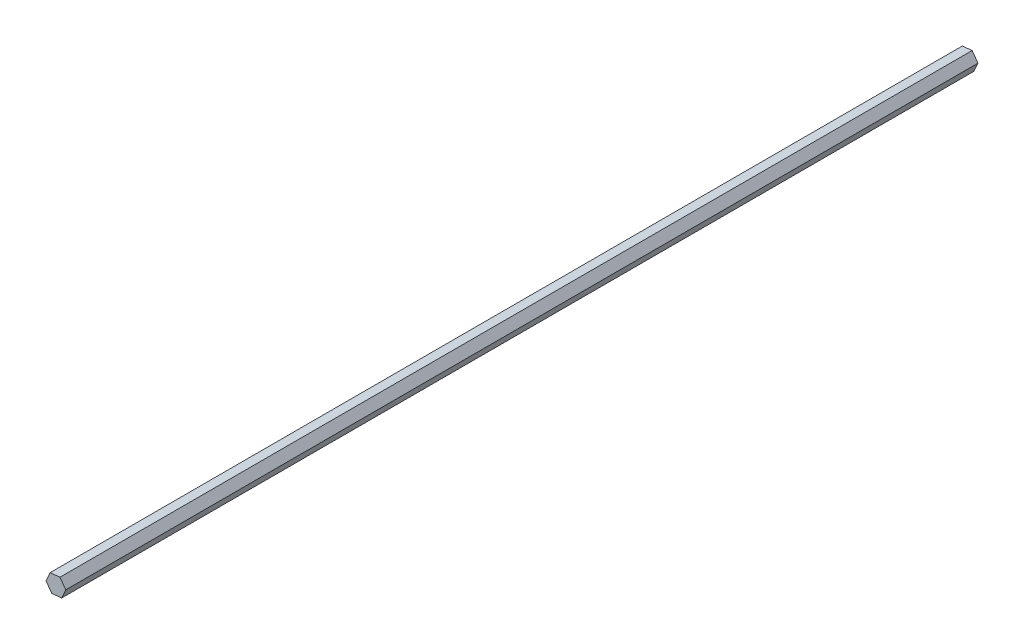
ISO-10303-21;
HEADER;
FILE_DESCRIPTION(('STEP AP214'),'2;1');
FILE_NAME('part.step','',(''),(''),'','','');
FILE_SCHEMA(('AUTOMOTIVE_DESIGN { 1 0 10303 214 1 1 1 1 }'));
ENDSEC;
DATA;
#1=APPLICATION_CONTEXT('core data for automotive mechanical design processes');
#2=APPLICATION_PROTOCOL_DEFINITION('international standard','automotive_design',2000,#1);
#3=PRODUCT_CONTEXT('',#1,'mechanical');
#4=PRODUCT('Part','Part','',(#3));
#5=PRODUCT_RELATED_PRODUCT_CATEGORY('part','',(#4));
#6=PRODUCT_DEFINITION_FORMATION('','',#4);
#7=PRODUCT_DEFINITION_CONTEXT('part definition',#1,'design');
#8=PRODUCT_DEFINITION('design','',#6,#7);
#9=PRODUCT_DEFINITION_SHAPE('','',#8);
#10=(LENGTH_UNIT() NAMED_UNIT(*) SI_UNIT(.MILLI.,.METRE.));
#11=(NAMED_UNIT(*) PLANE_ANGLE_UNIT() SI_UNIT($,.RADIAN.));
#12=(NAMED_UNIT(*) SI_UNIT($,.STERADIAN.) SOLID_ANGLE_UNIT());
#13=UNCERTAINTY_MEASURE_WITH_UNIT(LENGTH_MEASURE(1.E-05),#10,'distance_accuracy_value','');
#14=(GEOMETRIC_REPRESENTATION_CONTEXT(3) GLOBAL_UNCERTAINTY_ASSIGNED_CONTEXT((#13)) GLOBAL_UNIT_ASSIGNED_CONTEXT((#10,
#11,#12)) REPRESENTATION_CONTEXT('',''));
#15=CARTESIAN_POINT('',(0.,0.,0.));
#16=DIRECTION('',(0.,0.,1.));
#17=DIRECTION('',(1.,0.,0.));
#18=AXIS2_PLACEMENT_3D('',#15,#16,#17);
#19=CARTESIAN_POINT('',(2.98503862688406,6.6972291083211,673.1));
#20=DIRECTION('',(0.10412697657044,-0.99456401138906,0.));
#21=DIRECTION('',(0.994564011389061,0.10412697657044,0.));
#22=AXIS2_PLACEMENT_3D('',#19,#20,#21);
#23=PLANE('',#22);
#24=DIRECTION('',(-0.994564011389061,-0.10412697657044,0.));
#25=VECTOR('',#24,1.);
#26=CARTESIAN_POINT('',(2.98503862688406,6.6972291083211,0.));
#27=LINE('',#26,#25);
#28=CARTESIAN_POINT('',(2.98503862688406,6.6972291083211,0.));
#29=VERTEX_POINT('',#28);
#30=CARTESIAN_POINT('',(-4.30745122932864,5.93373383631997,0.));
#31=VERTEX_POINT('',#30);
#32=EDGE_CURVE('E117',#29,#31,#27,.T.);
#33=ORIENTED_EDGE('',*,*,#32,.T.);
#34=DIRECTION('',(0.,0.,-1.));
#35=VECTOR('',#34,1.);
#36=CARTESIAN_POINT('',(-4.30745122932864,5.93373383631997,673.1));
#37=LINE('',#36,#35);
#38=CARTESIAN_POINT('',(-4.30745122932864,5.93373383631997,673.1));
#39=VERTEX_POINT('',#38);
#40=EDGE_CURVE('E11',#39,#31,#37,.T.);
#41=ORIENTED_EDGE('',*,*,#40,.F.);
#42=DIRECTION('',(-0.994564011389061,-0.10412697657044,0.));
#43=VECTOR('',#42,1.);
#44=CARTESIAN_POINT('',(2.98503862688406,6.6972291083211,673.1));
#45=LINE('',#44,#43);
#46=CARTESIAN_POINT('',(2.98503862688406,6.6972291083211,673.1));
#47=VERTEX_POINT('',#46);
#48=EDGE_CURVE('E127',#47,#39,#45,.T.);
#49=ORIENTED_EDGE('',*,*,#48,.F.);
#50=DIRECTION('',(0.,0.,-1.));
#51=VECTOR('',#50,1.);
#52=CARTESIAN_POINT('',(2.98503862688406,6.6972291083211,673.1));
#53=LINE('',#52,#51);
#54=EDGE_CURVE('E113',#47,#29,#53,.T.);
#55=ORIENTED_EDGE('',*,*,#54,.T.);
#56=EDGE_LOOP('',(#33,#41,#49,#55));
#57=FACE_BOUND('',#56,.T.);
#58=ADVANCED_FACE('F33',(#57),#23,.F.);
#59=CARTESIAN_POINT('',(-4.30745122932864,5.93373383631997,673.1));
#60=DIRECTION('',(0.913381187837902,-0.407105398765262,0.));
#61=DIRECTION('',(0.407105398765262,0.913381187837902,0.));
#62=AXIS2_PLACEMENT_3D('',#59,#60,#61);
#63=PLANE('',#62);
#64=DIRECTION('',(-0.407105398765262,-0.913381187837902,0.));
#65=VECTOR('',#64,1.);
#66=CARTESIAN_POINT('',(-4.30745122932864,5.93373383631997,0.));
#67=LINE('',#66,#65);
#68=CARTESIAN_POINT('',(-7.2924898562127,-0.763495272001135,0.));
#69=VERTEX_POINT('',#68);
#70=EDGE_CURVE('E120',#31,#69,#67,.T.);
#71=ORIENTED_EDGE('',*,*,#70,.T.);
#72=DIRECTION('',(0.,0.,-1.));
#73=VECTOR('',#72,1.);
#74=CARTESIAN_POINT('',(-7.2924898562127,-0.763495272001135,673.1));
#75=LINE('',#74,#73);
#76=CARTESIAN_POINT('',(-7.2924898562127,-0.763495272001135,673.1));
#77=VERTEX_POINT('',#76);
#78=EDGE_CURVE('E41',#77,#69,#75,.T.);
#79=ORIENTED_EDGE('',*,*,#78,.F.);
#80=DIRECTION('',(-0.407105398765262,-0.913381187837902,0.));
#81=VECTOR('',#80,1.);
#82=CARTESIAN_POINT('',(-4.30745122932864,5.93373383631997,673.1));
#83=LINE('',#82,#81);
#84=EDGE_CURVE('E86',#39,#77,#83,.T.);
#85=ORIENTED_EDGE('',*,*,#84,.F.);
#86=ORIENTED_EDGE('',*,*,#40,.T.);
#87=EDGE_LOOP('',(#71,#79,#85,#86));
#88=FACE_BOUND('',#87,.T.);
#89=ADVANCED_FACE('F151',(#88),#63,.F.);
#90=CARTESIAN_POINT('',(-7.2924898562127,-0.763495272001135,673.1));
#91=DIRECTION('',(0.809254211267462,0.587458612623798,0.));
#92=DIRECTION('',(-0.587458612623798,0.809254211267462,0.));
#93=AXIS2_PLACEMENT_3D('',#90,#91,#92);
#94=PLANE('',#93);
#95=DIRECTION('',(0.587458612623798,-0.809254211267462,0.));
#96=VECTOR('',#95,1.);
#97=CARTESIAN_POINT('',(-7.2924898562127,-0.763495272001135,0.));
#98=LINE('',#97,#96);
#99=CARTESIAN_POINT('',(-2.98503862688406,-6.6972291083211,0.));
#100=VERTEX_POINT('',#99);
#101=EDGE_CURVE('E122',#69,#100,#98,.T.);
#102=ORIENTED_EDGE('',*,*,#101,.T.);
#103=DIRECTION('',(0.,0.,-1.));
#104=VECTOR('',#103,1.);
#105=CARTESIAN_POINT('',(-2.98503862688406,-6.6972291083211,673.1));
#106=LINE('',#105,#104);
#107=CARTESIAN_POINT('',(-2.98503862688406,-6.6972291083211,673.1));
#108=VERTEX_POINT('',#107);
#109=EDGE_CURVE('E108',#108,#100,#106,.T.);
#110=ORIENTED_EDGE('',*,*,#109,.F.);
#111=DIRECTION('',(0.587458612623798,-0.809254211267462,0.));
#112=VECTOR('',#111,1.);
#113=CARTESIAN_POINT('',(-7.2924898562127,-0.763495272001135,673.1));
#114=LINE('',#113,#112);
#115=EDGE_CURVE('E99',#77,#108,#114,.T.);
#116=ORIENTED_EDGE('',*,*,#115,.F.);
#117=ORIENTED_EDGE('',*,*,#78,.T.);
#118=EDGE_LOOP('',(#102,#110,#116,#117));
#119=FACE_BOUND('',#118,.T.);
#120=ADVANCED_FACE('F133',(#119),#94,.F.);
#121=CARTESIAN_POINT('',(-2.98503862688406,-6.6972291083211,673.1));
#122=DIRECTION('',(-0.10412697657044,0.99456401138906,0.));
#123=DIRECTION('',(-0.994564011389061,-0.10412697657044,0.));
#124=AXIS2_PLACEMENT_3D('',#121,#122,#123);
#125=PLANE('',#124);
#126=DIRECTION('',(0.99456401138906,0.10412697657044,0.));
#127=VECTOR('',#126,1.);
#128=CARTESIAN_POINT('',(-2.98503862688406,-6.6972291083211,0.));
#129=LINE('',#128,#127);
#130=CARTESIAN_POINT('',(4.30745122932864,-5.93373383631997,0.));
#131=VERTEX_POINT('',#130);
#132=EDGE_CURVE('E107',#100,#131,#129,.T.);
#133=ORIENTED_EDGE('',*,*,#132,.T.);
#134=DIRECTION('',(0.,0.,-1.));
#135=VECTOR('',#134,1.);
#136=CARTESIAN_POINT('',(4.30745122932864,-5.93373383631997,673.1));
#137=LINE('',#136,#135);
#138=CARTESIAN_POINT('',(4.30745122932864,-5.93373383631997,673.1));
#139=VERTEX_POINT('',#138);
#140=EDGE_CURVE('E104',#139,#131,#137,.T.);
#141=ORIENTED_EDGE('',*,*,#140,.F.);
#142=DIRECTION('',(0.99456401138906,0.10412697657044,0.));
#143=VECTOR('',#142,1.);
#144=CARTESIAN_POINT('',(-2.98503862688406,-6.6972291083211,673.1));
#145=LINE('',#144,#143);
#146=EDGE_CURVE('E93',#108,#139,#145,.T.);
#147=ORIENTED_EDGE('',*,*,#146,.F.);
#148=ORIENTED_EDGE('',*,*,#109,.T.);
#149=EDGE_LOOP('',(#133,#141,#147,#148));
#150=FACE_BOUND('',#149,.T.);
#151=ADVANCED_FACE('F105',(#150),#125,.F.);
#152=CARTESIAN_POINT('',(4.30745122932864,-5.93373383631997,673.1));
#153=DIRECTION('',(-0.913381187837902,0.407105398765262,0.));
#154=DIRECTION('',(-0.407105398765262,-0.913381187837902,0.));
#155=AXIS2_PLACEMENT_3D('',#152,#153,#154);
#156=PLANE('',#155);
#157=DIRECTION('',(0.407105398765262,0.913381187837902,0.));
#158=VECTOR('',#157,1.);
#159=CARTESIAN_POINT('',(4.30745122932864,-5.93373383631997,0.));
#160=LINE('',#159,#158);
#161=CARTESIAN_POINT('',(7.29248985621271,0.763495272001137,0.));
#162=VERTEX_POINT('',#161);
#163=EDGE_CURVE('E72',#131,#162,#160,.T.);
#164=ORIENTED_EDGE('',*,*,#163,.T.);
#165=DIRECTION('',(0.,0.,-1.));
#166=VECTOR('',#165,1.);
#167=CARTESIAN_POINT('',(7.29248985621271,0.763495272001137,673.1));
#168=LINE('',#167,#166);
#169=CARTESIAN_POINT('',(7.29248985621271,0.763495272001137,673.1));
#170=VERTEX_POINT('',#169);
#171=EDGE_CURVE('E109',#170,#162,#168,.T.);
#172=ORIENTED_EDGE('',*,*,#171,.F.);
#173=DIRECTION('',(0.407105398765262,0.913381187837902,0.));
#174=VECTOR('',#173,1.);
#175=CARTESIAN_POINT('',(4.30745122932864,-5.93373383631997,673.1));
#176=LINE('',#175,#174);
#177=EDGE_CURVE('E97',#139,#170,#176,.T.);
#178=ORIENTED_EDGE('',*,*,#177,.F.);
#179=ORIENTED_EDGE('',*,*,#140,.T.);
#180=EDGE_LOOP('',(#164,#172,#178,#179));
#181=FACE_BOUND('',#180,.T.);
#182=ADVANCED_FACE('F111',(#181),#156,.F.);
#183=CARTESIAN_POINT('',(7.29248985621271,0.763495272001137,673.1));
#184=DIRECTION('',(-0.809254211267462,-0.587458612623798,0.));
#185=DIRECTION('',(0.587458612623798,-0.809254211267462,0.));
#186=AXIS2_PLACEMENT_3D('',#183,#184,#185);
#187=PLANE('',#186);
#188=DIRECTION('',(-0.587458612623798,0.809254211267462,0.));
#189=VECTOR('',#188,1.);
#190=CARTESIAN_POINT('',(7.29248985621271,0.763495272001137,0.));
#191=LINE('',#190,#189);
#192=EDGE_CURVE('E78',#162,#29,#191,.T.);
#193=ORIENTED_EDGE('',*,*,#192,.T.);
#194=ORIENTED_EDGE('',*,*,#54,.F.);
#195=DIRECTION('',(-0.587458612623798,0.809254211267462,0.));
#196=VECTOR('',#195,1.);
#197=CARTESIAN_POINT('',(7.29248985621271,0.763495272001137,673.1));
#198=LINE('',#197,#196);
#199=EDGE_CURVE('E49',#170,#47,#198,.T.);
#200=ORIENTED_EDGE('',*,*,#199,.F.);
#201=ORIENTED_EDGE('',*,*,#171,.T.);
#202=EDGE_LOOP('',(#193,#194,#200,#201));
#203=FACE_BOUND('',#202,.T.);
#204=ADVANCED_FACE('F140',(#203),#187,.F.);
#205=CARTESIAN_POINT('',(0.,0.,673.1));
#206=DIRECTION('',(0.,0.,1.));
#207=DIRECTION('',(1.,0.,0.));
#208=AXIS2_PLACEMENT_3D('',#205,#206,#207);
#209=PLANE('',#208);
#210=ORIENTED_EDGE('',*,*,#48,.T.);
#211=ORIENTED_EDGE('',*,*,#84,.T.);
#212=ORIENTED_EDGE('',*,*,#115,.T.);
#213=ORIENTED_EDGE('',*,*,#146,.T.);
#214=ORIENTED_EDGE('',*,*,#177,.T.);
#215=ORIENTED_EDGE('',*,*,#199,.T.);
#216=EDGE_LOOP('',(#210,#211,#212,#213,#214,#215));
#217=FACE_BOUND('',#216,.T.);
#218=ADVANCED_FACE('F95',(#217),#209,.T.);
#219=CARTESIAN_POINT('',(0.,0.,0.));
#220=DIRECTION('',(0.,0.,1.));
#221=DIRECTION('',(1.,0.,0.));
#222=AXIS2_PLACEMENT_3D('',#219,#220,#221);
#223=PLANE('',#222);
#224=ORIENTED_EDGE('',*,*,#32,.F.);
#225=ORIENTED_EDGE('',*,*,#192,.F.);
#226=ORIENTED_EDGE('',*,*,#163,.F.);
#227=ORIENTED_EDGE('',*,*,#132,.F.);
#228=ORIENTED_EDGE('',*,*,#101,.F.);
#229=ORIENTED_EDGE('',*,*,#70,.F.);
#230=EDGE_LOOP('',(#224,#225,#226,#227,#228,#229));
#231=FACE_BOUND('',#230,.T.);
#232=ADVANCED_FACE('F136',(#231),#223,.F.);
#233=CLOSED_SHELL('',(#58,#89,#120,#151,#182,#204,#218,#232));
#234=MANIFOLD_SOLID_BREP('B2',#233);
#235=ADVANCED_BREP_SHAPE_REPRESENTATION('',(#18,#234),#14);
#236=SHAPE_DEFINITION_REPRESENTATION(#9,#235);
ENDSEC;
END-ISO-10303-21;
